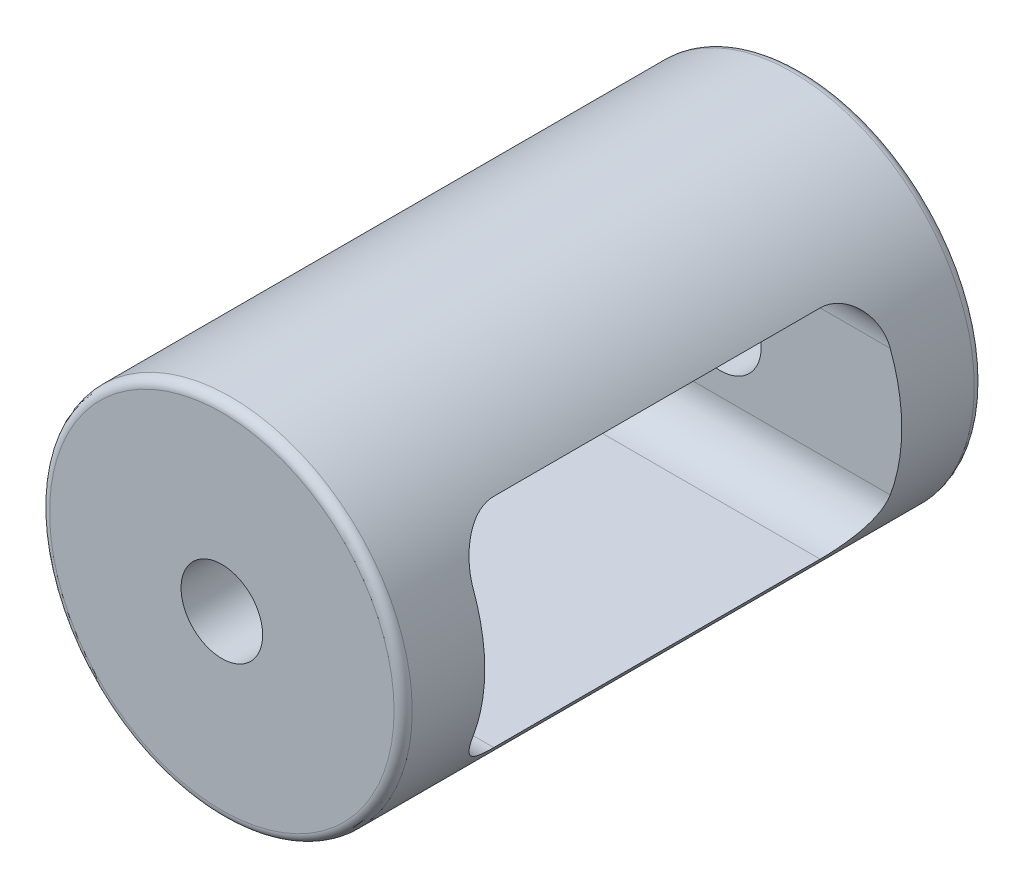
ISO-10303-21;
HEADER;
FILE_DESCRIPTION(('STEP AP214'),'2;1');
FILE_NAME('part.step','',(''),(''),'','','');
FILE_SCHEMA(('AUTOMOTIVE_DESIGN { 1 0 10303 214 1 1 1 1 }'));
ENDSEC;
DATA;
#1=APPLICATION_CONTEXT('core data for automotive mechanical design processes');
#2=APPLICATION_PROTOCOL_DEFINITION('international standard','automotive_design',2000,#1);
#3=PRODUCT_CONTEXT('',#1,'mechanical');
#4=PRODUCT('Part','Part','',(#3));
#5=PRODUCT_RELATED_PRODUCT_CATEGORY('part','',(#4));
#6=PRODUCT_DEFINITION_FORMATION('','',#4);
#7=PRODUCT_DEFINITION_CONTEXT('part definition',#1,'design');
#8=PRODUCT_DEFINITION('design','',#6,#7);
#9=PRODUCT_DEFINITION_SHAPE('','',#8);
#10=(LENGTH_UNIT() NAMED_UNIT(*) SI_UNIT(.MILLI.,.METRE.));
#11=(NAMED_UNIT(*) PLANE_ANGLE_UNIT() SI_UNIT($,.RADIAN.));
#12=(NAMED_UNIT(*) SI_UNIT($,.STERADIAN.) SOLID_ANGLE_UNIT());
#13=UNCERTAINTY_MEASURE_WITH_UNIT(LENGTH_MEASURE(1.E-05),#10,'distance_accuracy_value','');
#14=(GEOMETRIC_REPRESENTATION_CONTEXT(3) GLOBAL_UNCERTAINTY_ASSIGNED_CONTEXT((#13)) GLOBAL_UNIT_ASSIGNED_CONTEXT((#10,
#11,#12)) REPRESENTATION_CONTEXT('',''));
#15=CARTESIAN_POINT('',(0.,0.,0.));
#16=DIRECTION('',(0.,0.,1.));
#17=DIRECTION('',(1.,0.,0.));
#18=AXIS2_PLACEMENT_3D('',#15,#16,#17);
#19=CARTESIAN_POINT('',(0.,0.,-16.));
#20=DIRECTION('',(0.,0.,1.));
#21=DIRECTION('',(1.,0.,0.));
#22=AXIS2_PLACEMENT_3D('',#19,#20,#21);
#23=CYLINDRICAL_SURFACE('',#22,2.25);
#24=CARTESIAN_POINT('',(0.,0.,11.5));
#25=DIRECTION('',(0.,0.,1.));
#26=DIRECTION('',(0.,-1.,0.));
#27=AXIS2_PLACEMENT_3D('',#24,#25,#26);
#28=CIRCLE('',#27,2.25);
#29=CARTESIAN_POINT('',(0.,-2.25,11.5));
#30=VERTEX_POINT('',#29);
#31=EDGE_CURVE('E203',#30,#30,#28,.F.);
#32=ORIENTED_EDGE('',*,*,#31,.T.);
#33=EDGE_LOOP('',(#32));
#34=FACE_BOUND('',#33,.T.);
#35=CARTESIAN_POINT('',(0.,0.,16.));
#36=DIRECTION('',(0.,0.,1.));
#37=DIRECTION('',(1.,0.,0.));
#38=AXIS2_PLACEMENT_3D('',#35,#36,#37);
#39=CIRCLE('',#38,2.25);
#40=CARTESIAN_POINT('',(2.25,0.,16.));
#41=VERTEX_POINT('',#40);
#42=EDGE_CURVE('E127',#41,#41,#39,.T.);
#43=ORIENTED_EDGE('',*,*,#42,.T.);
#44=EDGE_LOOP('',(#43));
#45=FACE_BOUND('',#44,.T.);
#46=ADVANCED_FACE('F33',(#34,#45),#23,.F.);
#47=CARTESIAN_POINT('',(0.,0.,-16.));
#48=DIRECTION('',(0.,0.,1.));
#49=DIRECTION('',(1.,0.,0.));
#50=AXIS2_PLACEMENT_3D('',#47,#48,#49);
#51=CYLINDRICAL_SURFACE('',#50,10.);
#52=CARTESIAN_POINT('',(0.,0.,-15.5));
#53=DIRECTION('',(0.,0.,1.));
#54=DIRECTION('',(1.,0.,0.));
#55=AXIS2_PLACEMENT_3D('',#52,#53,#54);
#56=CIRCLE('',#55,10.);
#57=CARTESIAN_POINT('',(10.,0.,-15.5));
#58=VERTEX_POINT('',#57);
#59=EDGE_CURVE('E222',#58,#58,#56,.T.);
#60=ORIENTED_EDGE('',*,*,#59,.T.);
#61=EDGE_LOOP('',(#60));
#62=FACE_BOUND('',#61,.T.);
#63=CARTESIAN_POINT('',(0.,0.,15.5));
#64=DIRECTION('',(0.,0.,1.));
#65=DIRECTION('',(1.,0.,0.));
#66=AXIS2_PLACEMENT_3D('',#63,#64,#65);
#67=CIRCLE('',#66,10.);
#68=CARTESIAN_POINT('',(10.,0.,15.5));
#69=VERTEX_POINT('',#68);
#70=EDGE_CURVE('E225',#69,#69,#67,.F.);
#71=ORIENTED_EDGE('',*,*,#70,.T.);
#72=EDGE_LOOP('',(#71));
#73=FACE_BOUND('',#72,.T.);
#74=CARTESIAN_POINT('',(0.,0.,-11.5));
#75=DIRECTION('',(0.,0.,-1.));
#76=DIRECTION('',(-1.,0.,0.));
#77=AXIS2_PLACEMENT_3D('',#74,#75,#76);
#78=CIRCLE('',#77,10.);
#79=CARTESIAN_POINT('',(-9.3674969975976,3.5,-11.5));
#80=VERTEX_POINT('',#79);
#81=CARTESIAN_POINT('',(-9.3674969975976,-3.5,-11.5));
#82=VERTEX_POINT('',#81);
#83=EDGE_CURVE('E204',#80,#82,#78,.F.);
#84=ORIENTED_EDGE('',*,*,#83,.F.);
#85=CARTESIAN_POINT('',(-9.36749699759759,3.5,-11.5));
#86=CARTESIAN_POINT('',(-9.33881300838872,3.57679779767801,-11.50000419343));
#87=CARTESIAN_POINT('',(-9.30917450054917,3.65321635600599,-11.4964617615488));
#88=CARTESIAN_POINT('',(-9.24827772131187,3.80473021697697,-11.4825225671767));
#89=CARTESIAN_POINT('',(-9.21702027341599,3.87982616683646,-11.4721292585568));
#90=CARTESIAN_POINT('',(-9.15323500716552,4.02800039414573,-11.4447651854986));
#91=CARTESIAN_POINT('',(-9.12071099755101,4.10108373966556,-11.4278129499208));
#92=CARTESIAN_POINT('',(-9.05462904689147,4.24499403806026,-11.3875867861064));
#93=CARTESIAN_POINT('',(-9.02107097833622,4.31582071045588,-11.3643120754548));
#94=CARTESIAN_POINT('',(-8.91945989318898,4.52404277104583,-11.2854575240015));
#95=CARTESIAN_POINT('',(-8.85029885882603,4.65757429241699,-11.2207727747415));
#96=CARTESIAN_POINT('',(-8.71203172517001,4.9113621532663,-11.0688152810755));
#97=CARTESIAN_POINT('',(-8.64292588583235,5.03159715935904,-10.9815069678541));
#98=CARTESIAN_POINT('',(-8.50526476955227,5.26109883467947,-10.7812314483237));
#99=CARTESIAN_POINT('',(-8.43688107765584,5.36960644358342,-10.6672685976715));
#100=CARTESIAN_POINT('',(-8.30921807101162,5.5651163823241,-10.4178499691672));
#101=CARTESIAN_POINT('',(-8.24992304842102,5.65215597741509,-10.2824321149397));
#102=CARTESIAN_POINT('',(-8.16067623604615,5.779939721772,-10.0324076674762));
#103=CARTESIAN_POINT('',(-8.12713284370736,5.82683559369613,-9.92221042612537));
#104=CARTESIAN_POINT('',(-8.07068283944147,5.90477840482846,-9.69390507337898));
#105=CARTESIAN_POINT('',(-8.04775004500752,5.93586437527467,-9.57581726645009));
#106=CARTESIAN_POINT('',(-8.02094290067679,5.97199919560791,-9.38076258479124));
#107=CARTESIAN_POINT('',(-8.01313552735285,5.98245676211464,-9.30529224768133));
#108=CARTESIAN_POINT('',(-8.00264467008409,5.99647409527483,-9.153235415416));
#109=CARTESIAN_POINT('',(-7.99996991847481,6.00002210657657,-9.07664724104132));
#110=CARTESIAN_POINT('',(-8.,6.,-9.));
#111=B_SPLINE_CURVE_WITH_KNOTS('',3,(#85,#86,#87,#88,#89,#90,#91,#92,#93,#94,#95,#96,#97,#98,
#99,#100,#101,#102,#103,#104,#105,#106,#107,#108,#109,#110),.UNSPECIFIED.,.F.,.F.,(4,2,2,2,2,2,
2,2,2,2,2,2,4),(0.,0.245824308882853,0.491524780075365,0.736536160599718,0.981577875442101,
1.47036874583905,1.95993280685441,2.47201902699924,2.98320998537019,3.3548624704765,
3.72559291677862,3.95490931815688,4.1846155200303),.UNSPECIFIED.);
#112=CARTESIAN_POINT('',(-8.,6.,-9.));
#113=VERTEX_POINT('',#112);
#114=EDGE_CURVE('E11',#80,#113,#111,.T.);
#115=ORIENTED_EDGE('',*,*,#114,.T.);
#116=DIRECTION('',(0.,0.,1.));
#117=VECTOR('',#116,1.);
#118=CARTESIAN_POINT('',(-8.,6.,-16.));
#119=LINE('',#118,#117);
#120=CARTESIAN_POINT('',(-8.,6.,9.));
#121=VERTEX_POINT('',#120);
#122=EDGE_CURVE('E230',#121,#113,#119,.F.);
#123=ORIENTED_EDGE('',*,*,#122,.F.);
#124=CARTESIAN_POINT('',(-8.,6.,9.));
#125=CARTESIAN_POINT('',(-7.99998394531998,6.00001314286063,9.0616579728887));
#126=CARTESIAN_POINT('',(-8.00171029463047,5.99771943919547,9.12330506533736));
#127=CARTESIAN_POINT('',(-8.00852559797176,5.98862056440362,9.24603677440921));
#128=CARTESIAN_POINT('',(-8.0136122232133,5.98181851770626,9.30712175089259));
#129=CARTESIAN_POINT('',(-8.02697955263967,5.9638675484576,9.42785407473091));
#130=CARTESIAN_POINT('',(-8.0352378025046,5.95274917854666,9.48750846481274));
#131=CARTESIAN_POINT('',(-8.05472944779758,5.92634817322177,9.6053817553095));
#132=CARTESIAN_POINT('',(-8.06596321691509,5.91106501475347,9.66360047441685));
#133=CARTESIAN_POINT('',(-8.10368231497375,5.8593650570298,9.83523489282678));
#134=CARTESIAN_POINT('',(-8.13423426345228,5.81703397474711,9.94604498948242));
#135=CARTESIAN_POINT('',(-8.20381585343146,5.71848154571525,10.1584975134862));
#136=CARTESIAN_POINT('',(-8.24286013522797,5.6622361882591,10.2601236745878));
#137=CARTESIAN_POINT('',(-8.331052298177,5.53175664692004,10.4621074836602));
#138=CARTESIAN_POINT('',(-8.38080878236702,5.4563180412481,10.5614186706014));
#139=CARTESIAN_POINT('',(-8.48487630705677,5.29303852302427,10.746499915612));
#140=CARTESIAN_POINT('',(-8.53918944165192,5.20519189531174,10.8322636949385));
#141=CARTESIAN_POINT('',(-8.66019411545236,5.001746495453,11.0038857684244));
#142=CARTESIAN_POINT('',(-8.72733461556256,4.88400945500279,11.0869001039657));
#143=CARTESIAN_POINT('',(-8.86155887450736,4.63601290848361,11.2316051109654));
#144=CARTESIAN_POINT('',(-8.9286426376478,4.50575445880807,11.2932975792707));
#145=CARTESIAN_POINT('',(-9.02759313913248,4.30213964966877,11.3689496199204));
#146=CARTESIAN_POINT('',(-9.06052663748235,4.23236798272123,11.391451197995));
#147=CARTESIAN_POINT('',(-9.12537782977993,4.09066504073714,11.4303310056973));
#148=CARTESIAN_POINT('',(-9.15729562233219,4.01873397666019,11.4467098313902));
#149=CARTESIAN_POINT('',(-9.21986567256844,3.87303025734171,11.4731231497214));
#150=CARTESIAN_POINT('',(-9.25051576337738,3.79925476885258,11.4831471676801));
#151=CARTESIAN_POINT('',(-9.31025001405411,3.65044145311164,11.4965891020471));
#152=CARTESIAN_POINT('',(-9.33933344979237,3.57540306280647,11.5000039886671));
#153=CARTESIAN_POINT('',(-9.3674969975976,3.5,11.5));
#154=B_SPLINE_CURVE_WITH_KNOTS('',3,(#124,#125,#126,#127,#128,#129,#130,#131,#132,#133,#134,
#135,#136,#137,#138,#139,#140,#141,#142,#143,#144,#145,#146,#147,#148,#149,#150,#151,#152,#153),
.UNSPECIFIED.,.F.,.F.,(4,2,2,2,2,2,2,2,2,2,2,2,2,2,4),(0.,0.18488935407802,0.369650707573442,
0.553127416501457,0.736627178833243,1.10237164001718,1.46875169307284,1.8700937823985,
2.27162133722502,2.74648859900215,3.22131583276768,3.46219778067271,3.70305627201173,
3.94431074707528,4.18567579294761),.UNSPECIFIED.);
#155=CARTESIAN_POINT('',(-9.36749699759759,3.5,11.5));
#156=VERTEX_POINT('',#155);
#157=EDGE_CURVE('E126',#121,#156,#154,.T.);
#158=ORIENTED_EDGE('',*,*,#157,.T.);
#159=CARTESIAN_POINT('',(0.,0.,11.5));
#160=DIRECTION('',(0.,0.,1.));
#161=DIRECTION('',(0.,-1.,0.));
#162=AXIS2_PLACEMENT_3D('',#159,#160,#161);
#163=CIRCLE('',#162,10.);
#164=CARTESIAN_POINT('',(-9.3674969975976,-3.5,11.5));
#165=VERTEX_POINT('',#164);
#166=EDGE_CURVE('E111',#165,#156,#163,.F.);
#167=ORIENTED_EDGE('',*,*,#166,.F.);
#168=CARTESIAN_POINT('',(-9.3674969975976,-3.5,11.5));
#169=CARTESIAN_POINT('',(-9.33881300838872,-3.576797797678,11.50000419343));
#170=CARTESIAN_POINT('',(-9.30917450054917,-3.65321635600599,11.4964617615488));
#171=CARTESIAN_POINT('',(-9.24827772131187,-3.80473021697697,11.4825225671767));
#172=CARTESIAN_POINT('',(-9.21702027341599,-3.87982616683646,11.4721292585568));
#173=CARTESIAN_POINT('',(-9.15323500716552,-4.02800039414573,11.4447651854986));
#174=CARTESIAN_POINT('',(-9.12071099755101,-4.10108373966556,11.4278129499208));
#175=CARTESIAN_POINT('',(-9.05462904689148,-4.24499403806026,11.3875867861064));
#176=CARTESIAN_POINT('',(-9.02107097833622,-4.31582071045588,11.3643120754548));
#177=CARTESIAN_POINT('',(-8.91945989318898,-4.52404277104583,11.2854575240015));
#178=CARTESIAN_POINT('',(-8.85029885882603,-4.65757429241699,11.2207727747415));
#179=CARTESIAN_POINT('',(-8.71203172517001,-4.9113621532663,11.0688152810755));
#180=CARTESIAN_POINT('',(-8.64292588583235,-5.03159715935904,10.9815069678541));
#181=CARTESIAN_POINT('',(-8.50526476955227,-5.26109883467947,10.7812314483237));
#182=CARTESIAN_POINT('',(-8.43688107765584,-5.36960644358341,10.6672685976715));
#183=CARTESIAN_POINT('',(-8.30921807101162,-5.56511638232409,10.4178499691672));
#184=CARTESIAN_POINT('',(-8.24992304842103,-5.65215597741509,10.2824321149397));
#185=CARTESIAN_POINT('',(-8.16067623604615,-5.779939721772,10.0324076674762));
#186=CARTESIAN_POINT('',(-8.12713284370736,-5.82683559369613,9.92221042612536));
#187=CARTESIAN_POINT('',(-8.07068283944147,-5.90477840482846,9.69390507337898));
#188=CARTESIAN_POINT('',(-8.04775004500752,-5.93586437527466,9.57581726645009));
#189=CARTESIAN_POINT('',(-8.02094290067679,-5.9719991956079,9.38076258479124));
#190=CARTESIAN_POINT('',(-8.01313552735286,-5.98245676211464,9.30529224768133));
#191=CARTESIAN_POINT('',(-8.0026446700841,-5.99647409527483,9.153235415416));
#192=CARTESIAN_POINT('',(-7.99996991847482,-6.00002210657657,9.07664724104132));
#193=CARTESIAN_POINT('',(-8.,-6.,9.));
#194=B_SPLINE_CURVE_WITH_KNOTS('',3,(#168,#169,#170,#171,#172,#173,#174,#175,#176,#177,#178,
#179,#180,#181,#182,#183,#184,#185,#186,#187,#188,#189,#190,#191,#192,#193),.UNSPECIFIED.,.F.,
.F.,(4,2,2,2,2,2,2,2,2,2,2,2,4),(0.,0.245824308882853,0.491524780075366,0.736536160599718,
0.981577875442101,1.47036874583905,1.95993280685441,2.47201902699924,2.98320998537019,
3.3548624704765,3.72559291677862,3.95490931815688,4.1846155200303),.UNSPECIFIED.);
#195=CARTESIAN_POINT('',(-8.,-6.,9.));
#196=VERTEX_POINT('',#195);
#197=EDGE_CURVE('E122',#165,#196,#194,.T.);
#198=ORIENTED_EDGE('',*,*,#197,.T.);
#199=DIRECTION('',(0.,0.,1.));
#200=VECTOR('',#199,1.);
#201=CARTESIAN_POINT('',(-8.,-6.,-16.));
#202=LINE('',#201,#200);
#203=CARTESIAN_POINT('',(-8.,-6.,-9.));
#204=VERTEX_POINT('',#203);
#205=EDGE_CURVE('E228',#204,#196,#202,.T.);
#206=ORIENTED_EDGE('',*,*,#205,.F.);
#207=CARTESIAN_POINT('',(-8.,-6.,-9.));
#208=CARTESIAN_POINT('',(-7.99998394531998,-6.00001314286063,-9.0616579728887));
#209=CARTESIAN_POINT('',(-8.00171029463047,-5.99771943919547,-9.12330506533736));
#210=CARTESIAN_POINT('',(-8.00852559797177,-5.98862056440361,-9.24603677440921));
#211=CARTESIAN_POINT('',(-8.0136122232133,-5.98181851770625,-9.30712175089259));
#212=CARTESIAN_POINT('',(-8.02697955263968,-5.96386754845759,-9.42785407473091));
#213=CARTESIAN_POINT('',(-8.0352378025046,-5.95274917854666,-9.48750846481274));
#214=CARTESIAN_POINT('',(-8.05472944779758,-5.92634817322177,-9.6053817553095));
#215=CARTESIAN_POINT('',(-8.06596321691509,-5.91106501475347,-9.66360047441684));
#216=CARTESIAN_POINT('',(-8.10368231497375,-5.8593650570298,-9.83523489282678));
#217=CARTESIAN_POINT('',(-8.13423426345229,-5.8170339747471,-9.94604498948242));
#218=CARTESIAN_POINT('',(-8.20381585343146,-5.71848154571525,-10.1584975134862));
#219=CARTESIAN_POINT('',(-8.24286013522798,-5.6622361882591,-10.2601236745878));
#220=CARTESIAN_POINT('',(-8.331052298177,-5.53175664692004,-10.4621074836602));
#221=CARTESIAN_POINT('',(-8.38080878236702,-5.4563180412481,-10.5614186706014));
#222=CARTESIAN_POINT('',(-8.48487630705677,-5.29303852302426,-10.746499915612));
#223=CARTESIAN_POINT('',(-8.53918944165192,-5.20519189531173,-10.8322636949385));
#224=CARTESIAN_POINT('',(-8.66019411545236,-5.00174649545299,-11.0038857684244));
#225=CARTESIAN_POINT('',(-8.72733461556256,-4.88400945500279,-11.0869001039657));
#226=CARTESIAN_POINT('',(-8.86155887450736,-4.63601290848361,-11.2316051109654));
#227=CARTESIAN_POINT('',(-8.92864263764781,-4.50575445880806,-11.2932975792707));
#228=CARTESIAN_POINT('',(-9.02759313913248,-4.30213964966877,-11.3689496199204));
#229=CARTESIAN_POINT('',(-9.06052663748235,-4.23236798272122,-11.391451197995));
#230=CARTESIAN_POINT('',(-9.12537782977993,-4.09066504073713,-11.4303310056973));
#231=CARTESIAN_POINT('',(-9.15729562233219,-4.01873397666019,-11.4467098313902));
#232=CARTESIAN_POINT('',(-9.21986567256845,-3.87303025734171,-11.4731231497214));
#233=CARTESIAN_POINT('',(-9.25051576337739,-3.79925476885257,-11.4831471676801));
#234=CARTESIAN_POINT('',(-9.31025001405411,-3.65044145311164,-11.4965891020471));
#235=CARTESIAN_POINT('',(-9.33933344979237,-3.57540306280647,-11.5000039886671));
#236=CARTESIAN_POINT('',(-9.3674969975976,-3.5,-11.5));
#237=B_SPLINE_CURVE_WITH_KNOTS('',3,(#207,#208,#209,#210,#211,#212,#213,#214,#215,#216,#217,
#218,#219,#220,#221,#222,#223,#224,#225,#226,#227,#228,#229,#230,#231,#232,#233,#234,#235,#236),
.UNSPECIFIED.,.F.,.F.,(4,2,2,2,2,2,2,2,2,2,2,2,2,2,4),(0.,0.18488935407802,0.369650707573442,
0.553127416501453,0.736627178833243,1.10237164001718,1.46875169307284,1.8700937823985,
2.27162133722502,2.74648859900215,3.22131583276768,3.46219778067271,3.70305627201173,
3.94431074707528,4.18567579294761),.UNSPECIFIED.);
#238=EDGE_CURVE('E54',#204,#82,#237,.T.);
#239=ORIENTED_EDGE('',*,*,#238,.T.);
#240=EDGE_LOOP('',(#84,#115,#123,#158,#167,#198,#206,#239));
#241=FACE_BOUND('',#240,.T.);
#242=CARTESIAN_POINT('',(9.3674969975976,-3.5,-11.5));
#243=VERTEX_POINT('',#242);
#244=CARTESIAN_POINT('',(9.3674969975976,3.5,-11.5));
#245=VERTEX_POINT('',#244);
#246=EDGE_CURVE('E192',#243,#245,#78,.F.);
#247=ORIENTED_EDGE('',*,*,#246,.F.);
#248=CARTESIAN_POINT('',(9.3674969975976,-3.5,-11.5));
#249=CARTESIAN_POINT('',(9.33881300838872,-3.576797797678,-11.50000419343));
#250=CARTESIAN_POINT('',(9.30917450054917,-3.65321635600599,-11.4964617615488));
#251=CARTESIAN_POINT('',(9.24827772131187,-3.80473021697697,-11.4825225671767));
#252=CARTESIAN_POINT('',(9.21702027341599,-3.87982616683646,-11.4721292585568));
#253=CARTESIAN_POINT('',(9.15323500716552,-4.02800039414573,-11.4447651854986));
#254=CARTESIAN_POINT('',(9.12071099755101,-4.10108373966556,-11.4278129499208));
#255=CARTESIAN_POINT('',(9.05462904689148,-4.24499403806026,-11.3875867861064));
#256=CARTESIAN_POINT('',(9.02107097833622,-4.31582071045588,-11.3643120754548));
#257=CARTESIAN_POINT('',(8.91945989318898,-4.52404277104583,-11.2854575240015));
#258=CARTESIAN_POINT('',(8.85029885882603,-4.65757429241698,-11.2207727747415));
#259=CARTESIAN_POINT('',(8.71203172517002,-4.9113621532663,-11.0688152810755));
#260=CARTESIAN_POINT('',(8.64292588583235,-5.03159715935903,-10.9815069678542));
#261=CARTESIAN_POINT('',(8.50526476955227,-5.26109883467947,-10.7812314483237));
#262=CARTESIAN_POINT('',(8.43688107765584,-5.36960644358341,-10.6672685976715));
#263=CARTESIAN_POINT('',(8.30921807101162,-5.56511638232409,-10.4178499691672));
#264=CARTESIAN_POINT('',(8.24992304842103,-5.65215597741509,-10.2824321149397));
#265=CARTESIAN_POINT('',(8.16067623604616,-5.779939721772,-10.0324076674762));
#266=CARTESIAN_POINT('',(8.12713284370736,-5.82683559369613,-9.92221042612537));
#267=CARTESIAN_POINT('',(8.07068283944147,-5.90477840482846,-9.69390507337898));
#268=CARTESIAN_POINT('',(8.04775004500752,-5.93586437527466,-9.57581726645009));
#269=CARTESIAN_POINT('',(8.02094290067679,-5.9719991956079,-9.38076258479124));
#270=CARTESIAN_POINT('',(8.01313552735286,-5.98245676211463,-9.30529224768133));
#271=CARTESIAN_POINT('',(8.0026446700841,-5.99647409527483,-9.153235415416));
#272=CARTESIAN_POINT('',(7.99996991847482,-6.00002210657657,-9.07664724104132));
#273=CARTESIAN_POINT('',(8.,-6.,-9.));
#274=B_SPLINE_CURVE_WITH_KNOTS('',3,(#248,#249,#250,#251,#252,#253,#254,#255,#256,#257,#258,
#259,#260,#261,#262,#263,#264,#265,#266,#267,#268,#269,#270,#271,#272,#273),.UNSPECIFIED.,.F.,
.F.,(4,2,2,2,2,2,2,2,2,2,2,2,4),(0.,0.245824308882854,0.491524780075366,0.736536160599719,
0.981577875442101,1.47036874583905,1.95993280685441,2.47201902699925,2.98320998537019,
3.35486247047651,3.72559291677862,3.95490931815688,4.1846155200303),.UNSPECIFIED.);
#275=CARTESIAN_POINT('',(8.,-6.,-9.));
#276=VERTEX_POINT('',#275);
#277=EDGE_CURVE('E133',#243,#276,#274,.T.);
#278=ORIENTED_EDGE('',*,*,#277,.T.);
#279=DIRECTION('',(0.,0.,1.));
#280=VECTOR('',#279,1.);
#281=CARTESIAN_POINT('',(8.,-6.,-16.));
#282=LINE('',#281,#280);
#283=CARTESIAN_POINT('',(8.,-6.,9.));
#284=VERTEX_POINT('',#283);
#285=EDGE_CURVE('E233',#284,#276,#282,.F.);
#286=ORIENTED_EDGE('',*,*,#285,.F.);
#287=CARTESIAN_POINT('',(8.,-6.,9.));
#288=CARTESIAN_POINT('',(7.99998394531998,-6.00001314286063,9.06165797288869));
#289=CARTESIAN_POINT('',(8.00171029463047,-5.99771943919547,9.12330506533736));
#290=CARTESIAN_POINT('',(8.00852559797177,-5.98862056440361,9.24603677440921));
#291=CARTESIAN_POINT('',(8.0136122232133,-5.98181851770626,9.30712175089259));
#292=CARTESIAN_POINT('',(8.02697955263968,-5.96386754845759,9.42785407473091));
#293=CARTESIAN_POINT('',(8.0352378025046,-5.95274917854666,9.48750846481274));
#294=CARTESIAN_POINT('',(8.05472944779758,-5.92634817322177,9.6053817553095));
#295=CARTESIAN_POINT('',(8.06596321691509,-5.91106501475347,9.66360047441684));
#296=CARTESIAN_POINT('',(8.10368231497375,-5.8593650570298,9.83523489282678));
#297=CARTESIAN_POINT('',(8.13423426345229,-5.8170339747471,9.94604498948242));
#298=CARTESIAN_POINT('',(8.20381585343146,-5.71848154571525,10.1584975134862));
#299=CARTESIAN_POINT('',(8.24286013522798,-5.6622361882591,10.2601236745878));
#300=CARTESIAN_POINT('',(8.331052298177,-5.53175664692004,10.4621074836602));
#301=CARTESIAN_POINT('',(8.38080878236702,-5.4563180412481,10.5614186706014));
#302=CARTESIAN_POINT('',(8.48487630705677,-5.29303852302426,10.746499915612));
#303=CARTESIAN_POINT('',(8.53918944165192,-5.20519189531173,10.8322636949385));
#304=CARTESIAN_POINT('',(8.66019411545236,-5.00174649545299,11.0038857684244));
#305=CARTESIAN_POINT('',(8.72733461556256,-4.88400945500279,11.0869001039657));
#306=CARTESIAN_POINT('',(8.86155887450736,-4.63601290848361,11.2316051109654));
#307=CARTESIAN_POINT('',(8.92864263764781,-4.50575445880806,11.2932975792707));
#308=CARTESIAN_POINT('',(9.02759313913248,-4.30213964966877,11.3689496199204));
#309=CARTESIAN_POINT('',(9.06052663748235,-4.23236798272122,11.391451197995));
#310=CARTESIAN_POINT('',(9.12537782977993,-4.09066504073713,11.4303310056973));
#311=CARTESIAN_POINT('',(9.15729562233219,-4.01873397666019,11.4467098313902));
#312=CARTESIAN_POINT('',(9.21986567256844,-3.87303025734171,11.4731231497214));
#313=CARTESIAN_POINT('',(9.25051576337739,-3.79925476885258,11.4831471676801));
#314=CARTESIAN_POINT('',(9.31025001405411,-3.65044145311164,11.4965891020471));
#315=CARTESIAN_POINT('',(9.33933344979237,-3.57540306280647,11.5000039886671));
#316=CARTESIAN_POINT('',(9.3674969975976,-3.5,11.5));
#317=B_SPLINE_CURVE_WITH_KNOTS('',3,(#287,#288,#289,#290,#291,#292,#293,#294,#295,#296,#297,
#298,#299,#300,#301,#302,#303,#304,#305,#306,#307,#308,#309,#310,#311,#312,#313,#314,#315,#316),
.UNSPECIFIED.,.F.,.F.,(4,2,2,2,2,2,2,2,2,2,2,2,2,2,4),(0.,0.18488935407802,0.369650707573444,
0.553127416501457,0.736627178833243,1.10237164001718,1.46875169307284,1.8700937823985,
2.27162133722502,2.74648859900215,3.22131583276768,3.46219778067271,3.70305627201173,
3.94431074707528,4.18567579294761),.UNSPECIFIED.);
#318=CARTESIAN_POINT('',(9.3674969975976,-3.5,11.5));
#319=VERTEX_POINT('',#318);
#320=EDGE_CURVE('E134',#284,#319,#317,.T.);
#321=ORIENTED_EDGE('',*,*,#320,.T.);
#322=CARTESIAN_POINT('',(9.36749699759759,3.5,11.5));
#323=VERTEX_POINT('',#322);
#324=EDGE_CURVE('E114',#323,#319,#163,.F.);
#325=ORIENTED_EDGE('',*,*,#324,.F.);
#326=CARTESIAN_POINT('',(9.3674969975976,3.5,11.5));
#327=CARTESIAN_POINT('',(9.33881300838873,3.57679779767801,11.50000419343));
#328=CARTESIAN_POINT('',(9.30917450054917,3.65321635600599,11.4964617615488));
#329=CARTESIAN_POINT('',(9.24827772131187,3.80473021697697,11.4825225671767));
#330=CARTESIAN_POINT('',(9.21702027341599,3.87982616683646,11.4721292585568));
#331=CARTESIAN_POINT('',(9.15323500716552,4.02800039414573,11.4447651854986));
#332=CARTESIAN_POINT('',(9.12071099755101,4.10108373966556,11.4278129499208));
#333=CARTESIAN_POINT('',(9.05462904689148,4.24499403806026,11.3875867861064));
#334=CARTESIAN_POINT('',(9.02107097833622,4.31582071045588,11.3643120754548));
#335=CARTESIAN_POINT('',(8.91945989318898,4.52404277104583,11.2854575240015));
#336=CARTESIAN_POINT('',(8.85029885882602,4.65757429241699,11.2207727747415));
#337=CARTESIAN_POINT('',(8.71203172517001,4.9113621532663,11.0688152810755));
#338=CARTESIAN_POINT('',(8.64292588583235,5.03159715935904,10.9815069678542));
#339=CARTESIAN_POINT('',(8.50526476955227,5.26109883467947,10.7812314483237));
#340=CARTESIAN_POINT('',(8.43688107765584,5.36960644358342,10.6672685976715));
#341=CARTESIAN_POINT('',(8.30921807101162,5.5651163823241,10.4178499691672));
#342=CARTESIAN_POINT('',(8.24992304842103,5.65215597741509,10.2824321149397));
#343=CARTESIAN_POINT('',(8.16067623604615,5.779939721772,10.0324076674762));
#344=CARTESIAN_POINT('',(8.12713284370736,5.82683559369613,9.92221042612537));
#345=CARTESIAN_POINT('',(8.07068283944147,5.90477840482846,9.69390507337899));
#346=CARTESIAN_POINT('',(8.04775004500752,5.93586437527467,9.57581726645009));
#347=CARTESIAN_POINT('',(8.02094290067679,5.97199919560791,9.38076258479124));
#348=CARTESIAN_POINT('',(8.01313552735285,5.98245676211464,9.30529224768133));
#349=CARTESIAN_POINT('',(8.00264467008409,5.99647409527483,9.153235415416));
#350=CARTESIAN_POINT('',(7.99996991847481,6.00002210657657,9.07664724104132));
#351=CARTESIAN_POINT('',(8.,6.,9.));
#352=B_SPLINE_CURVE_WITH_KNOTS('',3,(#326,#327,#328,#329,#330,#331,#332,#333,#334,#335,#336,
#337,#338,#339,#340,#341,#342,#343,#344,#345,#346,#347,#348,#349,#350,#351),.UNSPECIFIED.,.F.,
.F.,(4,2,2,2,2,2,2,2,2,2,2,2,4),(0.,0.245824308882853,0.491524780075365,0.736536160599717,
0.9815778754421,1.47036874583905,1.95993280685441,2.47201902699925,2.98320998537019,
3.35486247047651,3.72559291677862,3.95490931815688,4.1846155200303),.UNSPECIFIED.);
#353=CARTESIAN_POINT('',(8.,6.,9.));
#354=VERTEX_POINT('',#353);
#355=EDGE_CURVE('E167',#323,#354,#352,.T.);
#356=ORIENTED_EDGE('',*,*,#355,.T.);
#357=DIRECTION('',(0.,0.,1.));
#358=VECTOR('',#357,1.);
#359=CARTESIAN_POINT('',(8.,6.,-16.));
#360=LINE('',#359,#358);
#361=CARTESIAN_POINT('',(8.,6.,-9.));
#362=VERTEX_POINT('',#361);
#363=EDGE_CURVE('E194',#362,#354,#360,.T.);
#364=ORIENTED_EDGE('',*,*,#363,.F.);
#365=CARTESIAN_POINT('',(8.,6.,-9.));
#366=CARTESIAN_POINT('',(7.99998394531998,6.00001314286063,-9.06165797288869));
#367=CARTESIAN_POINT('',(8.00171029463047,5.99771943919547,-9.12330506533736));
#368=CARTESIAN_POINT('',(8.00852559797176,5.98862056440362,-9.24603677440921));
#369=CARTESIAN_POINT('',(8.0136122232133,5.98181851770626,-9.30712175089259));
#370=CARTESIAN_POINT('',(8.02697955263967,5.9638675484576,-9.42785407473091));
#371=CARTESIAN_POINT('',(8.0352378025046,5.95274917854666,-9.48750846481274));
#372=CARTESIAN_POINT('',(8.05472944779758,5.92634817322177,-9.6053817553095));
#373=CARTESIAN_POINT('',(8.06596321691509,5.91106501475347,-9.66360047441684));
#374=CARTESIAN_POINT('',(8.10368231497375,5.8593650570298,-9.83523489282678));
#375=CARTESIAN_POINT('',(8.13423426345228,5.81703397474711,-9.94604498948242));
#376=CARTESIAN_POINT('',(8.20381585343146,5.71848154571525,-10.1584975134862));
#377=CARTESIAN_POINT('',(8.24286013522797,5.6622361882591,-10.2601236745878));
#378=CARTESIAN_POINT('',(8.331052298177,5.53175664692004,-10.4621074836602));
#379=CARTESIAN_POINT('',(8.38080878236702,5.4563180412481,-10.5614186706014));
#380=CARTESIAN_POINT('',(8.48487630705677,5.29303852302427,-10.746499915612));
#381=CARTESIAN_POINT('',(8.53918944165192,5.20519189531174,-10.8322636949385));
#382=CARTESIAN_POINT('',(8.66019411545236,5.001746495453,-11.0038857684244));
#383=CARTESIAN_POINT('',(8.72733461556256,4.88400945500279,-11.0869001039657));
#384=CARTESIAN_POINT('',(8.86155887450736,4.63601290848361,-11.2316051109654));
#385=CARTESIAN_POINT('',(8.9286426376478,4.50575445880806,-11.2932975792707));
#386=CARTESIAN_POINT('',(9.02759313913248,4.30213964966877,-11.3689496199204));
#387=CARTESIAN_POINT('',(9.06052663748235,4.23236798272122,-11.391451197995));
#388=CARTESIAN_POINT('',(9.12537782977993,4.09066504073714,-11.4303310056973));
#389=CARTESIAN_POINT('',(9.15729562233219,4.01873397666019,-11.4467098313902));
#390=CARTESIAN_POINT('',(9.21986567256844,3.87303025734171,-11.4731231497214));
#391=CARTESIAN_POINT('',(9.25051576337739,3.79925476885258,-11.4831471676801));
#392=CARTESIAN_POINT('',(9.31025001405411,3.65044145311164,-11.4965891020471));
#393=CARTESIAN_POINT('',(9.33933344979237,3.57540306280647,-11.5000039886671));
#394=CARTESIAN_POINT('',(9.36749699759759,3.5,-11.5));
#395=B_SPLINE_CURVE_WITH_KNOTS('',3,(#365,#366,#367,#368,#369,#370,#371,#372,#373,#374,#375,
#376,#377,#378,#379,#380,#381,#382,#383,#384,#385,#386,#387,#388,#389,#390,#391,#392,#393,#394),
.UNSPECIFIED.,.F.,.F.,(4,2,2,2,2,2,2,2,2,2,2,2,2,2,4),(0.,0.18488935407802,0.369650707573442,
0.553127416501457,0.736627178833243,1.10237164001718,1.46875169307284,1.8700937823985,
2.27162133722502,2.74648859900215,3.22131583276768,3.46219778067271,3.70305627201173,
3.94431074707528,4.18567579294761),.UNSPECIFIED.);
#396=EDGE_CURVE('E47',#362,#245,#395,.T.);
#397=ORIENTED_EDGE('',*,*,#396,.T.);
#398=EDGE_LOOP('',(#247,#278,#286,#321,#325,#356,#364,#397));
#399=FACE_BOUND('',#398,.T.);
#400=ADVANCED_FACE('F120',(#62,#73,#241,#399),#51,.T.);
#401=CARTESIAN_POINT('',(0.,0.,-16.));
#402=DIRECTION('',(0.,0.,1.));
#403=DIRECTION('',(1.,0.,0.));
#404=AXIS2_PLACEMENT_3D('',#401,#402,#403);
#405=PLANE('',#404);
#406=CARTESIAN_POINT('',(0.,0.,-16.));
#407=DIRECTION('',(0.,0.,1.));
#408=DIRECTION('',(1.,0.,0.));
#409=AXIS2_PLACEMENT_3D('',#406,#407,#408);
#410=CIRCLE('',#409,9.5);
#411=CARTESIAN_POINT('',(9.5,0.,-16.));
#412=VERTEX_POINT('',#411);
#413=EDGE_CURVE('E219',#412,#412,#410,.F.);
#414=ORIENTED_EDGE('',*,*,#413,.T.);
#415=EDGE_LOOP('',(#414));
#416=FACE_BOUND('',#415,.T.);
#417=CARTESIAN_POINT('',(0.,0.,-16.));
#418=DIRECTION('',(0.,0.,1.));
#419=DIRECTION('',(1.,0.,0.));
#420=AXIS2_PLACEMENT_3D('',#417,#418,#419);
#421=CIRCLE('',#420,2.25);
#422=CARTESIAN_POINT('',(2.25,0.,-16.));
#423=VERTEX_POINT('',#422);
#424=EDGE_CURVE('E237',#423,#423,#421,.T.);
#425=ORIENTED_EDGE('',*,*,#424,.T.);
#426=EDGE_LOOP('',(#425));
#427=FACE_BOUND('',#426,.T.);
#428=ADVANCED_FACE('F159',(#416,#427),#405,.F.);
#429=CARTESIAN_POINT('',(0.,0.,-11.5));
#430=DIRECTION('',(0.,0.,-1.));
#431=DIRECTION('',(-1.,0.,0.));
#432=AXIS2_PLACEMENT_3D('',#429,#430,#431);
#433=CIRCLE('',#432,2.25);
#434=CARTESIAN_POINT('',(-2.25,0.,-11.5));
#435=VERTEX_POINT('',#434);
#436=EDGE_CURVE('E240',#435,#435,#433,.F.);
#437=ORIENTED_EDGE('',*,*,#436,.T.);
#438=EDGE_LOOP('',(#437));
#439=FACE_BOUND('',#438,.T.);
#440=ORIENTED_EDGE('',*,*,#424,.F.);
#441=EDGE_LOOP('',(#440));
#442=FACE_BOUND('',#441,.T.);
#443=ADVANCED_FACE('F267',(#439,#442),#23,.F.);
#444=CARTESIAN_POINT('',(0.,0.,16.));
#445=DIRECTION('',(0.,0.,1.));
#446=DIRECTION('',(1.,0.,0.));
#447=AXIS2_PLACEMENT_3D('',#444,#445,#446);
#448=PLANE('',#447);
#449=CARTESIAN_POINT('',(0.,0.,16.));
#450=DIRECTION('',(0.,0.,1.));
#451=DIRECTION('',(1.,0.,0.));
#452=AXIS2_PLACEMENT_3D('',#449,#450,#451);
#453=CIRCLE('',#452,9.5);
#454=CARTESIAN_POINT('',(9.5,0.,16.));
#455=VERTEX_POINT('',#454);
#456=EDGE_CURVE('E118',#455,#455,#453,.T.);
#457=ORIENTED_EDGE('',*,*,#456,.T.);
#458=EDGE_LOOP('',(#457));
#459=FACE_BOUND('',#458,.T.);
#460=ORIENTED_EDGE('',*,*,#42,.F.);
#461=EDGE_LOOP('',(#460));
#462=FACE_BOUND('',#461,.T.);
#463=ADVANCED_FACE('F273',(#459,#462),#448,.T.);
#464=CARTESIAN_POINT('',(-10.,6.,11.5));
#465=DIRECTION('',(0.,0.,1.));
#466=DIRECTION('',(0.,-1.,0.));
#467=AXIS2_PLACEMENT_3D('',#464,#465,#466);
#468=PLANE('',#467);
#469=ORIENTED_EDGE('',*,*,#166,.T.);
#470=DIRECTION('',(1.,0.,0.));
#471=VECTOR('',#470,1.);
#472=CARTESIAN_POINT('',(8.,3.5,11.5));
#473=LINE('',#472,#471);
#474=EDGE_CURVE('E117',#156,#323,#473,.T.);
#475=ORIENTED_EDGE('',*,*,#474,.T.);
#476=ORIENTED_EDGE('',*,*,#324,.T.);
#477=DIRECTION('',(1.,0.,0.));
#478=VECTOR('',#477,1.);
#479=CARTESIAN_POINT('',(-8.,-3.5,11.5));
#480=LINE('',#479,#478);
#481=EDGE_CURVE('E106',#319,#165,#480,.F.);
#482=ORIENTED_EDGE('',*,*,#481,.T.);
#483=EDGE_LOOP('',(#469,#475,#476,#482));
#484=FACE_BOUND('',#483,.T.);
#485=ORIENTED_EDGE('',*,*,#31,.F.);
#486=EDGE_LOOP('',(#485));
#487=FACE_BOUND('',#486,.T.);
#488=ADVANCED_FACE('F108',(#484,#487),#468,.F.);
#489=CARTESIAN_POINT('',(-10.,6.,-11.5));
#490=DIRECTION('',(0.,0.,-1.));
#491=DIRECTION('',(-1.,0.,0.));
#492=AXIS2_PLACEMENT_3D('',#489,#490,#491);
#493=PLANE('',#492);
#494=ORIENTED_EDGE('',*,*,#83,.T.);
#495=DIRECTION('',(1.,0.,0.));
#496=VECTOR('',#495,1.);
#497=CARTESIAN_POINT('',(8.,-3.5,-11.5));
#498=LINE('',#497,#496);
#499=EDGE_CURVE('E202',#82,#243,#498,.T.);
#500=ORIENTED_EDGE('',*,*,#499,.T.);
#501=ORIENTED_EDGE('',*,*,#246,.T.);
#502=DIRECTION('',(1.,0.,0.));
#503=VECTOR('',#502,1.);
#504=CARTESIAN_POINT('',(-8.,3.5,-11.5));
#505=LINE('',#504,#503);
#506=EDGE_CURVE('E61',#245,#80,#505,.F.);
#507=ORIENTED_EDGE('',*,*,#506,.T.);
#508=EDGE_LOOP('',(#494,#500,#501,#507));
#509=FACE_BOUND('',#508,.T.);
#510=ORIENTED_EDGE('',*,*,#436,.F.);
#511=EDGE_LOOP('',(#510));
#512=FACE_BOUND('',#511,.T.);
#513=ADVANCED_FACE('F199',(#509,#512),#493,.F.);
#514=CARTESIAN_POINT('',(-10.,6.,11.5));
#515=DIRECTION('',(0.,1.,0.));
#516=DIRECTION('',(0.,0.,1.));
#517=AXIS2_PLACEMENT_3D('',#514,#515,#516);
#518=PLANE('',#517);
#519=ORIENTED_EDGE('',*,*,#363,.T.);
#520=DIRECTION('',(1.,0.,0.));
#521=VECTOR('',#520,1.);
#522=CARTESIAN_POINT('',(-8.,6.,9.));
#523=LINE('',#522,#521);
#524=EDGE_CURVE('E212',#354,#121,#523,.F.);
#525=ORIENTED_EDGE('',*,*,#524,.T.);
#526=ORIENTED_EDGE('',*,*,#122,.T.);
#527=DIRECTION('',(1.,0.,0.));
#528=VECTOR('',#527,1.);
#529=CARTESIAN_POINT('',(8.,6.,-9.));
#530=LINE('',#529,#528);
#531=EDGE_CURVE('E214',#113,#362,#530,.T.);
#532=ORIENTED_EDGE('',*,*,#531,.T.);
#533=EDGE_LOOP('',(#519,#525,#526,#532));
#534=FACE_BOUND('',#533,.T.);
#535=ADVANCED_FACE('F253',(#534),#518,.F.);
#536=CARTESIAN_POINT('',(-10.,-6.,11.5));
#537=DIRECTION('',(0.,-1.,0.));
#538=DIRECTION('',(0.,0.,-1.));
#539=AXIS2_PLACEMENT_3D('',#536,#537,#538);
#540=PLANE('',#539);
#541=ORIENTED_EDGE('',*,*,#205,.T.);
#542=DIRECTION('',(1.,0.,0.));
#543=VECTOR('',#542,1.);
#544=CARTESIAN_POINT('',(8.,-6.,9.));
#545=LINE('',#544,#543);
#546=EDGE_CURVE('E132',#196,#284,#545,.T.);
#547=ORIENTED_EDGE('',*,*,#546,.T.);
#548=ORIENTED_EDGE('',*,*,#285,.T.);
#549=DIRECTION('',(1.,0.,0.));
#550=VECTOR('',#549,1.);
#551=CARTESIAN_POINT('',(-8.,-6.,-9.));
#552=LINE('',#551,#550);
#553=EDGE_CURVE('E208',#276,#204,#552,.F.);
#554=ORIENTED_EDGE('',*,*,#553,.T.);
#555=EDGE_LOOP('',(#541,#547,#548,#554));
#556=FACE_BOUND('',#555,.T.);
#557=ADVANCED_FACE('F251',(#556),#540,.F.);
#558=CARTESIAN_POINT('',(0.,0.,-15.5));
#559=DIRECTION('',(0.,0.,1.));
#560=DIRECTION('',(1.,0.,0.));
#561=AXIS2_PLACEMENT_3D('',#558,#559,#560);
#562=TOROIDAL_SURFACE('',#561,9.5,0.5);
#563=ORIENTED_EDGE('',*,*,#413,.F.);
#564=EDGE_LOOP('',(#563));
#565=FACE_BOUND('',#564,.T.);
#566=ORIENTED_EDGE('',*,*,#59,.F.);
#567=EDGE_LOOP('',(#566));
#568=FACE_BOUND('',#567,.T.);
#569=ADVANCED_FACE('F162',(#565,#568),#562,.T.);
#570=CARTESIAN_POINT('',(0.,0.,15.5));
#571=DIRECTION('',(0.,0.,1.));
#572=DIRECTION('',(1.,0.,0.));
#573=AXIS2_PLACEMENT_3D('',#570,#571,#572);
#574=TOROIDAL_SURFACE('',#573,9.5,0.5);
#575=ORIENTED_EDGE('',*,*,#70,.F.);
#576=EDGE_LOOP('',(#575));
#577=FACE_BOUND('',#576,.T.);
#578=ORIENTED_EDGE('',*,*,#456,.F.);
#579=EDGE_LOOP('',(#578));
#580=FACE_BOUND('',#579,.T.);
#581=ADVANCED_FACE('F259',(#577,#580),#574,.T.);
#582=CARTESIAN_POINT('',(-10.,3.5,9.));
#583=DIRECTION('',(-1.,0.,0.));
#584=DIRECTION('',(0.,0.,1.));
#585=AXIS2_PLACEMENT_3D('',#582,#583,#584);
#586=CYLINDRICAL_SURFACE('',#585,2.5);
#587=ORIENTED_EDGE('',*,*,#157,.F.);
#588=ORIENTED_EDGE('',*,*,#524,.F.);
#589=ORIENTED_EDGE('',*,*,#355,.F.);
#590=ORIENTED_EDGE('',*,*,#474,.F.);
#591=EDGE_LOOP('',(#587,#588,#589,#590));
#592=FACE_BOUND('',#591,.T.);
#593=ADVANCED_FACE('F324',(#592),#586,.F.);
#594=CARTESIAN_POINT('',(-10.,-3.5,9.));
#595=DIRECTION('',(-1.,0.,0.));
#596=DIRECTION('',(0.,0.,1.));
#597=AXIS2_PLACEMENT_3D('',#594,#595,#596);
#598=CYLINDRICAL_SURFACE('',#597,2.5);
#599=ORIENTED_EDGE('',*,*,#197,.F.);
#600=ORIENTED_EDGE('',*,*,#481,.F.);
#601=ORIENTED_EDGE('',*,*,#320,.F.);
#602=ORIENTED_EDGE('',*,*,#546,.F.);
#603=EDGE_LOOP('',(#599,#600,#601,#602));
#604=FACE_BOUND('',#603,.T.);
#605=ADVANCED_FACE('F130',(#604),#598,.F.);
#606=CARTESIAN_POINT('',(-10.,-3.5,-9.));
#607=DIRECTION('',(-1.,0.,0.));
#608=DIRECTION('',(0.,0.,1.));
#609=AXIS2_PLACEMENT_3D('',#606,#607,#608);
#610=CYLINDRICAL_SURFACE('',#609,2.5);
#611=ORIENTED_EDGE('',*,*,#238,.F.);
#612=ORIENTED_EDGE('',*,*,#553,.F.);
#613=ORIENTED_EDGE('',*,*,#277,.F.);
#614=ORIENTED_EDGE('',*,*,#499,.F.);
#615=EDGE_LOOP('',(#611,#612,#613,#614));
#616=FACE_BOUND('',#615,.T.);
#617=ADVANCED_FACE('F247',(#616),#610,.F.);
#618=CARTESIAN_POINT('',(-10.,3.5,-9.));
#619=DIRECTION('',(-1.,0.,0.));
#620=DIRECTION('',(0.,0.,1.));
#621=AXIS2_PLACEMENT_3D('',#618,#619,#620);
#622=CYLINDRICAL_SURFACE('',#621,2.5);
#623=ORIENTED_EDGE('',*,*,#114,.F.);
#624=ORIENTED_EDGE('',*,*,#506,.F.);
#625=ORIENTED_EDGE('',*,*,#396,.F.);
#626=ORIENTED_EDGE('',*,*,#531,.F.);
#627=EDGE_LOOP('',(#623,#624,#625,#626));
#628=FACE_BOUND('',#627,.T.);
#629=ADVANCED_FACE('F35',(#628),#622,.F.);
#630=CLOSED_SHELL('',(#46,#400,#428,#443,#463,#488,#513,#535,#557,#569,#581,#593,#605,#617,#629));
#631=MANIFOLD_SOLID_BREP('B2',#630);
#632=ADVANCED_BREP_SHAPE_REPRESENTATION('',(#18,#631),#14);
#633=SHAPE_DEFINITION_REPRESENTATION(#9,#632);
ENDSEC;
END-ISO-10303-21;
